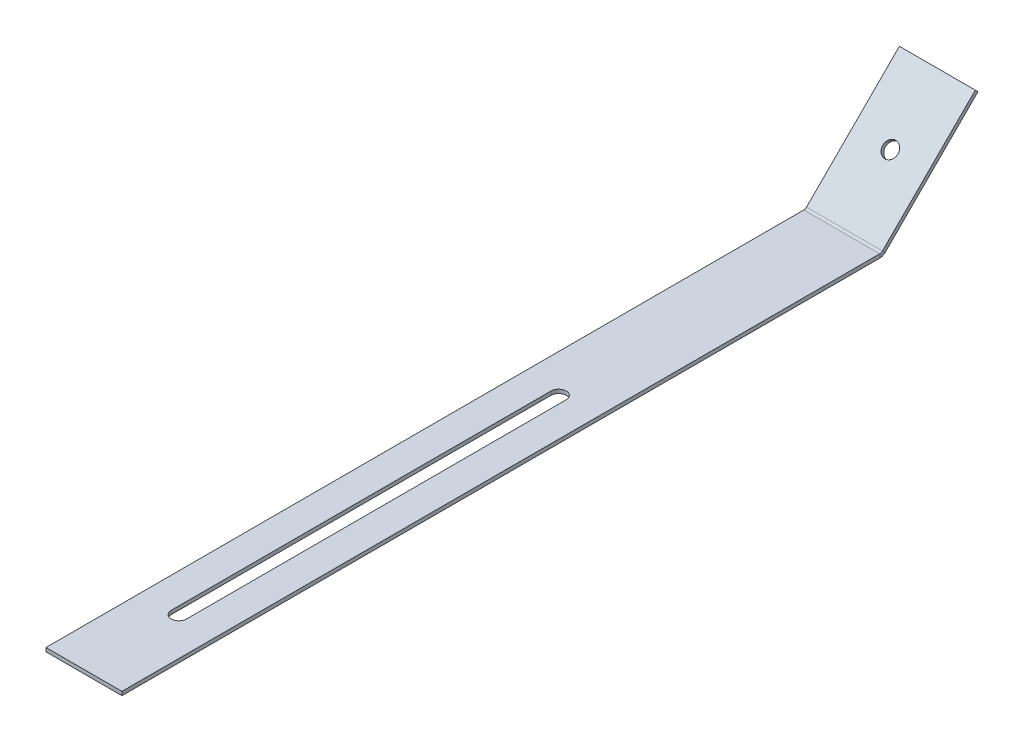
ISO-10303-21;
HEADER;
FILE_DESCRIPTION(('STEP AP214'),'2;1');
FILE_NAME('part.step','',(''),(''),'','','');
FILE_SCHEMA(('AUTOMOTIVE_DESIGN { 1 0 10303 214 1 1 1 1 }'));
ENDSEC;
DATA;
#1=APPLICATION_CONTEXT('core data for automotive mechanical design processes');
#2=APPLICATION_PROTOCOL_DEFINITION('international standard','automotive_design',2000,#1);
#3=PRODUCT_CONTEXT('',#1,'mechanical');
#4=PRODUCT('Part','Part','',(#3));
#5=PRODUCT_RELATED_PRODUCT_CATEGORY('part','',(#4));
#6=PRODUCT_DEFINITION_FORMATION('','',#4);
#7=PRODUCT_DEFINITION_CONTEXT('part definition',#1,'design');
#8=PRODUCT_DEFINITION('design','',#6,#7);
#9=PRODUCT_DEFINITION_SHAPE('','',#8);
#10=(LENGTH_UNIT() NAMED_UNIT(*) SI_UNIT(.MILLI.,.METRE.));
#11=(NAMED_UNIT(*) PLANE_ANGLE_UNIT() SI_UNIT($,.RADIAN.));
#12=(NAMED_UNIT(*) SI_UNIT($,.STERADIAN.) SOLID_ANGLE_UNIT());
#13=UNCERTAINTY_MEASURE_WITH_UNIT(LENGTH_MEASURE(1.E-05),#10,'distance_accuracy_value','');
#14=(GEOMETRIC_REPRESENTATION_CONTEXT(3) GLOBAL_UNCERTAINTY_ASSIGNED_CONTEXT((#13)) GLOBAL_UNIT_ASSIGNED_CONTEXT((#10,
#11,#12)) REPRESENTATION_CONTEXT('',''));
#15=CARTESIAN_POINT('',(0.,0.,0.));
#16=DIRECTION('',(0.,0.,1.));
#17=DIRECTION('',(1.,0.,0.));
#18=AXIS2_PLACEMENT_3D('',#15,#16,#17);
#19=CARTESIAN_POINT('',(40.,0.585786437626914,-400.585786437627));
#20=DIRECTION('',(1.,0.,0.));
#21=DIRECTION('',(0.,0.,-1.));
#22=AXIS2_PLACEMENT_3D('',#19,#20,#21);
#23=PLANE('',#22);
#24=DIRECTION('',(0.,-0.707106781186547,-0.707106781186547));
#25=VECTOR('',#24,1.);
#26=CARTESIAN_POINT('',(40.,0.585786437626914,-400.585786437627));
#27=LINE('',#26,#25);
#28=CARTESIAN_POINT('',(40.,0.585786437626914,-400.585786437627));
#29=VERTEX_POINT('',#28);
#30=CARTESIAN_POINT('',(40.,-0.828427124746176,-402.));
#31=VERTEX_POINT('',#30);
#32=EDGE_CURVE('E11',#29,#31,#27,.T.);
#33=ORIENTED_EDGE('',*,*,#32,.F.);
#34=CARTESIAN_POINT('',(40.,1.99999999999999,-399.171572875254));
#35=DIRECTION('',(-1.,0.,0.));
#36=DIRECTION('',(0.,0.,1.));
#37=AXIS2_PLACEMENT_3D('',#34,#35,#36);
#38=CIRCLE('',#37,2.);
#39=CARTESIAN_POINT('',(40.,0.,-399.171572875254));
#40=VERTEX_POINT('',#39);
#41=EDGE_CURVE('E178',#40,#29,#38,.F.);
#42=ORIENTED_EDGE('',*,*,#41,.F.);
#43=DIRECTION('',(0.,1.,0.));
#44=VECTOR('',#43,1.);
#45=CARTESIAN_POINT('',(40.,-2.00000000000001,-399.171572875254));
#46=LINE('',#45,#44);
#47=CARTESIAN_POINT('',(40.,-2.00000000000001,-399.171572875254));
#48=VERTEX_POINT('',#47);
#49=EDGE_CURVE('E51',#48,#40,#46,.T.);
#50=ORIENTED_EDGE('',*,*,#49,.F.);
#51=CARTESIAN_POINT('',(40.,1.99999999999999,-399.171572875254));
#52=DIRECTION('',(1.,0.,0.));
#53=DIRECTION('',(0.,0.,-1.));
#54=AXIS2_PLACEMENT_3D('',#51,#52,#53);
#55=CIRCLE('',#54,4.);
#56=EDGE_CURVE('E190',#48,#31,#55,.T.);
#57=ORIENTED_EDGE('',*,*,#56,.T.);
#58=EDGE_LOOP('',(#33,#42,#50,#57));
#59=FACE_BOUND('',#58,.T.);
#60=ADVANCED_FACE('F44',(#59),#23,.T.);
#61=CARTESIAN_POINT('',(40.,-2.00000000000001,-399.171572875254));
#62=DIRECTION('',(1.,0.,0.));
#63=DIRECTION('',(0.,0.,-1.));
#64=AXIS2_PLACEMENT_3D('',#61,#62,#63);
#65=PLANE('',#64);
#66=DIRECTION('',(0.,0.70710678118655,-0.707106781186545));
#67=VECTOR('',#66,1.);
#68=CARTESIAN_POINT('',(40.,0.,-400.));
#69=LINE('',#68,#67);
#70=CARTESIAN_POINT('',(40.,49.4974746830584,-449.497474683058));
#71=VERTEX_POINT('',#70);
#72=EDGE_CURVE('E175',#29,#71,#69,.T.);
#73=ORIENTED_EDGE('',*,*,#72,.F.);
#74=ORIENTED_EDGE('',*,*,#32,.T.);
#75=DIRECTION('',(0.,0.70710678118655,-0.707106781186545));
#76=VECTOR('',#75,1.);
#77=CARTESIAN_POINT('',(40.,-1.41421356237309,-401.414213562373));
#78=LINE('',#77,#76);
#79=CARTESIAN_POINT('',(40.,48.0832611206854,-450.911688245431));
#80=VERTEX_POINT('',#79);
#81=EDGE_CURVE('E169',#31,#80,#78,.T.);
#82=ORIENTED_EDGE('',*,*,#81,.T.);
#83=DIRECTION('',(0.,-0.707106781186547,-0.707106781186547));
#84=VECTOR('',#83,1.);
#85=CARTESIAN_POINT('',(40.,49.4974746830584,-449.497474683058));
#86=LINE('',#85,#84);
#87=EDGE_CURVE('E171',#71,#80,#86,.T.);
#88=ORIENTED_EDGE('',*,*,#87,.F.);
#89=EDGE_LOOP('',(#73,#74,#82,#88));
#90=FACE_BOUND('',#89,.T.);
#91=ADVANCED_FACE('F271',(#90),#65,.T.);
#92=CARTESIAN_POINT('',(0.,0.,-399.171572875254));
#93=DIRECTION('',(-1.,0.,0.));
#94=DIRECTION('',(0.,0.,1.));
#95=AXIS2_PLACEMENT_3D('',#92,#93,#94);
#96=PLANE('',#95);
#97=DIRECTION('',(0.,-1.,0.));
#98=VECTOR('',#97,1.);
#99=CARTESIAN_POINT('',(0.,0.,-399.171572875254));
#100=LINE('',#99,#98);
#101=CARTESIAN_POINT('',(0.,0.,-399.171572875254));
#102=VERTEX_POINT('',#101);
#103=CARTESIAN_POINT('',(0.,-2.00000000000001,-399.171572875254));
#104=VERTEX_POINT('',#103);
#105=EDGE_CURVE('E237',#102,#104,#100,.T.);
#106=ORIENTED_EDGE('',*,*,#105,.F.);
#107=CARTESIAN_POINT('',(0.,1.99999999999999,-399.171572875254));
#108=DIRECTION('',(-1.,0.,0.));
#109=DIRECTION('',(0.,0.,1.));
#110=AXIS2_PLACEMENT_3D('',#107,#108,#109);
#111=CIRCLE('',#110,2.);
#112=CARTESIAN_POINT('',(0.,0.585786437626914,-400.585786437627));
#113=VERTEX_POINT('',#112);
#114=EDGE_CURVE('E202',#102,#113,#111,.F.);
#115=ORIENTED_EDGE('',*,*,#114,.T.);
#116=DIRECTION('',(0.,0.707106781186547,0.707106781186547));
#117=VECTOR('',#116,1.);
#118=CARTESIAN_POINT('',(0.,-0.828427124746176,-402.));
#119=LINE('',#118,#117);
#120=CARTESIAN_POINT('',(0.,-0.828427124746176,-402.));
#121=VERTEX_POINT('',#120);
#122=EDGE_CURVE('E235',#121,#113,#119,.T.);
#123=ORIENTED_EDGE('',*,*,#122,.F.);
#124=CARTESIAN_POINT('',(0.,1.99999999999999,-399.171572875254));
#125=DIRECTION('',(1.,0.,0.));
#126=DIRECTION('',(0.,0.,-1.));
#127=AXIS2_PLACEMENT_3D('',#124,#125,#126);
#128=CIRCLE('',#127,4.);
#129=EDGE_CURVE('E172',#104,#121,#128,.T.);
#130=ORIENTED_EDGE('',*,*,#129,.F.);
#131=EDGE_LOOP('',(#106,#115,#123,#130));
#132=FACE_BOUND('',#131,.T.);
#133=ADVANCED_FACE('F278',(#132),#96,.T.);
#134=CARTESIAN_POINT('',(0.,-0.828427124746176,-402.));
#135=DIRECTION('',(-1.,0.,0.));
#136=DIRECTION('',(0.,0.,1.));
#137=AXIS2_PLACEMENT_3D('',#134,#135,#136);
#138=PLANE('',#137);
#139=DIRECTION('',(0.,0.,-1.));
#140=VECTOR('',#139,1.);
#141=CARTESIAN_POINT('',(0.,0.,0.));
#142=LINE('',#141,#140);
#143=CARTESIAN_POINT('',(0.,0.,0.));
#144=VERTEX_POINT('',#143);
#145=EDGE_CURVE('E205',#144,#102,#142,.T.);
#146=ORIENTED_EDGE('',*,*,#145,.T.);
#147=ORIENTED_EDGE('',*,*,#105,.T.);
#148=DIRECTION('',(0.,0.,-1.));
#149=VECTOR('',#148,1.);
#150=CARTESIAN_POINT('',(0.,-2.,0.));
#151=LINE('',#150,#149);
#152=CARTESIAN_POINT('',(0.,-2.,0.));
#153=VERTEX_POINT('',#152);
#154=EDGE_CURVE('E211',#153,#104,#151,.T.);
#155=ORIENTED_EDGE('',*,*,#154,.F.);
#156=DIRECTION('',(0.,1.,0.));
#157=VECTOR('',#156,1.);
#158=CARTESIAN_POINT('',(0.,-2.,0.));
#159=LINE('',#158,#157);
#160=EDGE_CURVE('E208',#153,#144,#159,.T.);
#161=ORIENTED_EDGE('',*,*,#160,.T.);
#162=EDGE_LOOP('',(#146,#147,#155,#161));
#163=FACE_BOUND('',#162,.T.);
#164=ADVANCED_FACE('F280',(#163),#138,.T.);
#165=CARTESIAN_POINT('',(40.,-1.41421356237309,-401.414213562373));
#166=DIRECTION('',(0.,0.707106781186545,0.70710678118655));
#167=DIRECTION('',(0.,-0.70710678118655,0.707106781186545));
#168=AXIS2_PLACEMENT_3D('',#165,#166,#167);
#169=PLANE('',#168);
#170=CARTESIAN_POINT('',(20.,23.3345237791562,-426.162950903902));
#171=DIRECTION('',(0.,0.707106781186545,0.70710678118655));
#172=DIRECTION('',(0.,-0.70710678118655,0.707106781186545));
#173=AXIS2_PLACEMENT_3D('',#170,#171,#172);
#174=CIRCLE('',#173,3.99999999999999);
#175=CARTESIAN_POINT('',(20.,20.50609665441,-423.334523779156));
#176=VERTEX_POINT('',#175);
#177=EDGE_CURVE('E165',#176,#176,#174,.F.);
#178=ORIENTED_EDGE('',*,*,#177,.F.);
#179=EDGE_LOOP('',(#178));
#180=FACE_BOUND('',#179,.T.);
#181=DIRECTION('',(0.,0.70710678118655,-0.707106781186545));
#182=VECTOR('',#181,1.);
#183=CARTESIAN_POINT('',(0.,-1.41421356237309,-401.414213562373));
#184=LINE('',#183,#182);
#185=CARTESIAN_POINT('',(0.,48.0832611206854,-450.911688245431));
#186=VERTEX_POINT('',#185);
#187=EDGE_CURVE('E168',#121,#186,#184,.T.);
#188=ORIENTED_EDGE('',*,*,#187,.T.);
#189=DIRECTION('',(-1.,0.,0.));
#190=VECTOR('',#189,1.);
#191=CARTESIAN_POINT('',(40.,48.0832611206854,-450.911688245431));
#192=LINE('',#191,#190);
#193=EDGE_CURVE('E233',#80,#186,#192,.T.);
#194=ORIENTED_EDGE('',*,*,#193,.F.);
#195=ORIENTED_EDGE('',*,*,#81,.F.);
#196=DIRECTION('',(-1.,0.,0.));
#197=VECTOR('',#196,1.);
#198=CARTESIAN_POINT('',(40.,-0.828427124746176,-402.));
#199=LINE('',#198,#197);
#200=EDGE_CURVE('E193',#31,#121,#199,.T.);
#201=ORIENTED_EDGE('',*,*,#200,.T.);
#202=EDGE_LOOP('',(#188,#194,#195,#201));
#203=FACE_BOUND('',#202,.T.);
#204=ADVANCED_FACE('F267',(#180,#203),#169,.F.);
#205=CARTESIAN_POINT('',(40.,49.4974746830584,-449.497474683058));
#206=DIRECTION('',(0.,0.707106781186548,-0.707106781186548));
#207=DIRECTION('',(0.,0.707106781186548,0.707106781186548));
#208=AXIS2_PLACEMENT_3D('',#205,#206,#207);
#209=PLANE('',#208);
#210=DIRECTION('',(0.,-0.707106781186547,-0.707106781186547));
#211=VECTOR('',#210,1.);
#212=CARTESIAN_POINT('',(0.,49.4974746830584,-449.497474683058));
#213=LINE('',#212,#211);
#214=CARTESIAN_POINT('',(0.,49.4974746830584,-449.497474683058));
#215=VERTEX_POINT('',#214);
#216=EDGE_CURVE('E196',#215,#186,#213,.T.);
#217=ORIENTED_EDGE('',*,*,#216,.F.);
#218=DIRECTION('',(-1.,0.,0.));
#219=VECTOR('',#218,1.);
#220=CARTESIAN_POINT('',(40.,49.4974746830584,-449.497474683058));
#221=LINE('',#220,#219);
#222=EDGE_CURVE('E231',#71,#215,#221,.T.);
#223=ORIENTED_EDGE('',*,*,#222,.F.);
#224=ORIENTED_EDGE('',*,*,#87,.T.);
#225=ORIENTED_EDGE('',*,*,#193,.T.);
#226=EDGE_LOOP('',(#217,#223,#224,#225));
#227=FACE_BOUND('',#226,.T.);
#228=ADVANCED_FACE('F288',(#227),#209,.T.);
#229=CARTESIAN_POINT('',(40.,0.,-400.));
#230=DIRECTION('',(0.,0.707106781186545,0.70710678118655));
#231=DIRECTION('',(0.,-0.70710678118655,0.707106781186545));
#232=AXIS2_PLACEMENT_3D('',#229,#230,#231);
#233=PLANE('',#232);
#234=CARTESIAN_POINT('',(20.,24.7487373415292,-424.748737341529));
#235=DIRECTION('',(0.,0.707106781186546,0.70710678118655));
#236=DIRECTION('',(0.,-0.70710678118655,0.707106781186546));
#237=AXIS2_PLACEMENT_3D('',#234,#235,#236);
#238=CIRCLE('',#237,3.99999999999999);
#239=CARTESIAN_POINT('',(20.,21.920310216783,-421.920310216783));
#240=VERTEX_POINT('',#239);
#241=EDGE_CURVE('E161',#240,#240,#238,.T.);
#242=ORIENTED_EDGE('',*,*,#241,.F.);
#243=EDGE_LOOP('',(#242));
#244=FACE_BOUND('',#243,.T.);
#245=DIRECTION('',(0.,0.70710678118655,-0.707106781186545));
#246=VECTOR('',#245,1.);
#247=CARTESIAN_POINT('',(0.,0.,-400.));
#248=LINE('',#247,#246);
#249=EDGE_CURVE('E199',#113,#215,#248,.T.);
#250=ORIENTED_EDGE('',*,*,#249,.F.);
#251=DIRECTION('',(-1.,0.,0.));
#252=VECTOR('',#251,1.);
#253=CARTESIAN_POINT('',(40.,0.585786437626914,-400.585786437627));
#254=LINE('',#253,#252);
#255=EDGE_CURVE('E228',#29,#113,#254,.T.);
#256=ORIENTED_EDGE('',*,*,#255,.F.);
#257=ORIENTED_EDGE('',*,*,#72,.T.);
#258=ORIENTED_EDGE('',*,*,#222,.T.);
#259=EDGE_LOOP('',(#250,#256,#257,#258));
#260=FACE_BOUND('',#259,.T.);
#261=ADVANCED_FACE('F274',(#244,#260),#233,.T.);
#262=CARTESIAN_POINT('',(40.,1.99999999999999,-399.171572875254));
#263=DIRECTION('',(-1.,0.,0.));
#264=DIRECTION('',(0.,0.,1.));
#265=AXIS2_PLACEMENT_3D('',#262,#263,#264);
#266=CYLINDRICAL_SURFACE('',#265,2.);
#267=ORIENTED_EDGE('',*,*,#114,.F.);
#268=DIRECTION('',(-1.,0.,0.));
#269=VECTOR('',#268,1.);
#270=CARTESIAN_POINT('',(40.,0.,-399.171572875254));
#271=LINE('',#270,#269);
#272=EDGE_CURVE('E225',#40,#102,#271,.T.);
#273=ORIENTED_EDGE('',*,*,#272,.F.);
#274=ORIENTED_EDGE('',*,*,#41,.T.);
#275=ORIENTED_EDGE('',*,*,#255,.T.);
#276=EDGE_LOOP('',(#267,#273,#274,#275));
#277=FACE_BOUND('',#276,.T.);
#278=ADVANCED_FACE('F249',(#277),#266,.F.);
#279=CARTESIAN_POINT('',(40.,0.,0.));
#280=DIRECTION('',(0.,1.,0.));
#281=DIRECTION('',(0.,0.,1.));
#282=AXIS2_PLACEMENT_3D('',#279,#280,#281);
#283=PLANE('',#282);
#284=CARTESIAN_POINT('',(20.,0.,-250.));
#285=DIRECTION('',(0.,1.,0.));
#286=DIRECTION('',(0.,0.,1.));
#287=AXIS2_PLACEMENT_3D('',#284,#285,#286);
#288=CIRCLE('',#287,4.);
#289=CARTESIAN_POINT('',(24.,0.,-250.));
#290=VERTEX_POINT('',#289);
#291=CARTESIAN_POINT('',(16.,0.,-250.));
#292=VERTEX_POINT('',#291);
#293=EDGE_CURVE('E58',#290,#292,#288,.T.);
#294=ORIENTED_EDGE('',*,*,#293,.F.);
#295=DIRECTION('',(0.,0.,-1.));
#296=VECTOR('',#295,1.);
#297=CARTESIAN_POINT('',(24.,0.,-49.9999999999999));
#298=LINE('',#297,#296);
#299=CARTESIAN_POINT('',(24.,0.,-49.9999999999999));
#300=VERTEX_POINT('',#299);
#301=EDGE_CURVE('E150',#300,#290,#298,.T.);
#302=ORIENTED_EDGE('',*,*,#301,.F.);
#303=CARTESIAN_POINT('',(20.,0.,-49.9999999999999));
#304=DIRECTION('',(0.,1.,0.));
#305=DIRECTION('',(0.,0.,1.));
#306=AXIS2_PLACEMENT_3D('',#303,#304,#305);
#307=CIRCLE('',#306,4.);
#308=CARTESIAN_POINT('',(16.,0.,-49.9999999999999));
#309=VERTEX_POINT('',#308);
#310=EDGE_CURVE('E134',#309,#300,#307,.T.);
#311=ORIENTED_EDGE('',*,*,#310,.F.);
#312=DIRECTION('',(0.,0.,1.));
#313=VECTOR('',#312,1.);
#314=CARTESIAN_POINT('',(16.,0.,-49.9999999999999));
#315=LINE('',#314,#313);
#316=EDGE_CURVE('E143',#292,#309,#315,.T.);
#317=ORIENTED_EDGE('',*,*,#316,.F.);
#318=EDGE_LOOP('',(#294,#302,#311,#317));
#319=FACE_BOUND('',#318,.T.);
#320=ORIENTED_EDGE('',*,*,#145,.F.);
#321=DIRECTION('',(-1.,0.,0.));
#322=VECTOR('',#321,1.);
#323=CARTESIAN_POINT('',(40.,0.,0.));
#324=LINE('',#323,#322);
#325=CARTESIAN_POINT('',(40.,0.,0.));
#326=VERTEX_POINT('',#325);
#327=EDGE_CURVE('E223',#326,#144,#324,.T.);
#328=ORIENTED_EDGE('',*,*,#327,.F.);
#329=DIRECTION('',(0.,0.,-1.));
#330=VECTOR('',#329,1.);
#331=CARTESIAN_POINT('',(40.,0.,0.));
#332=LINE('',#331,#330);
#333=EDGE_CURVE('E181',#326,#40,#332,.T.);
#334=ORIENTED_EDGE('',*,*,#333,.T.);
#335=ORIENTED_EDGE('',*,*,#272,.T.);
#336=EDGE_LOOP('',(#320,#328,#334,#335));
#337=FACE_BOUND('',#336,.T.);
#338=ADVANCED_FACE('F147',(#319,#337),#283,.T.);
#339=CARTESIAN_POINT('',(40.,-2.,0.));
#340=DIRECTION('',(0.,0.,1.));
#341=DIRECTION('',(1.,0.,0.));
#342=AXIS2_PLACEMENT_3D('',#339,#340,#341);
#343=PLANE('',#342);
#344=ORIENTED_EDGE('',*,*,#160,.F.);
#345=DIRECTION('',(-1.,0.,0.));
#346=VECTOR('',#345,1.);
#347=CARTESIAN_POINT('',(40.,-2.,0.));
#348=LINE('',#347,#346);
#349=CARTESIAN_POINT('',(40.,-2.,0.));
#350=VERTEX_POINT('',#349);
#351=EDGE_CURVE('E221',#350,#153,#348,.T.);
#352=ORIENTED_EDGE('',*,*,#351,.F.);
#353=DIRECTION('',(0.,1.,0.));
#354=VECTOR('',#353,1.);
#355=CARTESIAN_POINT('',(40.,-2.,0.));
#356=LINE('',#355,#354);
#357=EDGE_CURVE('E184',#350,#326,#356,.T.);
#358=ORIENTED_EDGE('',*,*,#357,.T.);
#359=ORIENTED_EDGE('',*,*,#327,.T.);
#360=EDGE_LOOP('',(#344,#352,#358,#359));
#361=FACE_BOUND('',#360,.T.);
#362=ADVANCED_FACE('F254',(#361),#343,.T.);
#363=CARTESIAN_POINT('',(40.,-2.,0.));
#364=DIRECTION('',(0.,1.,0.));
#365=DIRECTION('',(0.,0.,1.));
#366=AXIS2_PLACEMENT_3D('',#363,#364,#365);
#367=PLANE('',#366);
#368=DIRECTION('',(0.,0.,1.));
#369=VECTOR('',#368,1.);
#370=CARTESIAN_POINT('',(24.,-2.,-49.9999999999999));
#371=LINE('',#370,#369);
#372=CARTESIAN_POINT('',(24.,-2.,-250.));
#373=VERTEX_POINT('',#372);
#374=CARTESIAN_POINT('',(24.,-2.,-49.9999999999999));
#375=VERTEX_POINT('',#374);
#376=EDGE_CURVE('E482',#373,#375,#371,.T.);
#377=ORIENTED_EDGE('',*,*,#376,.F.);
#378=CARTESIAN_POINT('',(20.,-2.,-250.));
#379=DIRECTION('',(0.,1.,0.));
#380=DIRECTION('',(0.,0.,1.));
#381=AXIS2_PLACEMENT_3D('',#378,#379,#380);
#382=CIRCLE('',#381,4.);
#383=CARTESIAN_POINT('',(16.,-2.,-250.));
#384=VERTEX_POINT('',#383);
#385=EDGE_CURVE('E162',#384,#373,#382,.F.);
#386=ORIENTED_EDGE('',*,*,#385,.F.);
#387=DIRECTION('',(0.,0.,-1.));
#388=VECTOR('',#387,1.);
#389=CARTESIAN_POINT('',(16.,-2.,-49.9999999999999));
#390=LINE('',#389,#388);
#391=CARTESIAN_POINT('',(16.,-2.,-49.9999999999999));
#392=VERTEX_POINT('',#391);
#393=EDGE_CURVE('E159',#392,#384,#390,.T.);
#394=ORIENTED_EDGE('',*,*,#393,.F.);
#395=CARTESIAN_POINT('',(20.,-2.,-49.9999999999999));
#396=DIRECTION('',(0.,1.,0.));
#397=DIRECTION('',(0.,0.,1.));
#398=AXIS2_PLACEMENT_3D('',#395,#396,#397);
#399=CIRCLE('',#398,4.);
#400=EDGE_CURVE('E137',#375,#392,#399,.F.);
#401=ORIENTED_EDGE('',*,*,#400,.F.);
#402=EDGE_LOOP('',(#377,#386,#394,#401));
#403=FACE_BOUND('',#402,.T.);
#404=ORIENTED_EDGE('',*,*,#154,.T.);
#405=DIRECTION('',(-1.,0.,0.));
#406=VECTOR('',#405,1.);
#407=CARTESIAN_POINT('',(40.,-2.00000000000001,-399.171572875254));
#408=LINE('',#407,#406);
#409=EDGE_CURVE('E218',#48,#104,#408,.T.);
#410=ORIENTED_EDGE('',*,*,#409,.F.);
#411=DIRECTION('',(0.,0.,-1.));
#412=VECTOR('',#411,1.);
#413=CARTESIAN_POINT('',(40.,-2.,0.));
#414=LINE('',#413,#412);
#415=EDGE_CURVE('E187',#350,#48,#414,.T.);
#416=ORIENTED_EDGE('',*,*,#415,.F.);
#417=ORIENTED_EDGE('',*,*,#351,.T.);
#418=EDGE_LOOP('',(#404,#410,#416,#417));
#419=FACE_BOUND('',#418,.T.);
#420=ADVANCED_FACE('F257',(#403,#419),#367,.F.);
#421=CARTESIAN_POINT('',(40.,1.99999999999999,-399.171572875254));
#422=DIRECTION('',(-1.,0.,0.));
#423=DIRECTION('',(0.,0.,1.));
#424=AXIS2_PLACEMENT_3D('',#421,#422,#423);
#425=CYLINDRICAL_SURFACE('',#424,4.);
#426=ORIENTED_EDGE('',*,*,#129,.T.);
#427=ORIENTED_EDGE('',*,*,#200,.F.);
#428=ORIENTED_EDGE('',*,*,#56,.F.);
#429=ORIENTED_EDGE('',*,*,#409,.T.);
#430=EDGE_LOOP('',(#426,#427,#428,#429));
#431=FACE_BOUND('',#430,.T.);
#432=ADVANCED_FACE('F262',(#431),#425,.T.);
#433=CARTESIAN_POINT('',(40.,1.99999999999999,-399.171572875254));
#434=DIRECTION('',(-1.,0.,0.));
#435=DIRECTION('',(0.,0.,1.));
#436=AXIS2_PLACEMENT_3D('',#433,#434,#435);
#437=PLANE('',#436);
#438=ORIENTED_EDGE('',*,*,#415,.T.);
#439=ORIENTED_EDGE('',*,*,#49,.T.);
#440=ORIENTED_EDGE('',*,*,#333,.F.);
#441=ORIENTED_EDGE('',*,*,#357,.F.);
#442=EDGE_LOOP('',(#438,#439,#440,#441));
#443=FACE_BOUND('',#442,.T.);
#444=ADVANCED_FACE('F241',(#443),#437,.F.);
#445=CARTESIAN_POINT('',(0.,1.99999999999999,-399.171572875254));
#446=DIRECTION('',(-1.,0.,0.));
#447=DIRECTION('',(0.,0.,1.));
#448=AXIS2_PLACEMENT_3D('',#445,#446,#447);
#449=PLANE('',#448);
#450=ORIENTED_EDGE('',*,*,#187,.F.);
#451=ORIENTED_EDGE('',*,*,#122,.T.);
#452=ORIENTED_EDGE('',*,*,#249,.T.);
#453=ORIENTED_EDGE('',*,*,#216,.T.);
#454=EDGE_LOOP('',(#450,#451,#452,#453));
#455=FACE_BOUND('',#454,.T.);
#456=ADVANCED_FACE('F394',(#455),#449,.T.);
#457=CARTESIAN_POINT('',(20.,15.3345237791562,-434.162950903902));
#458=DIRECTION('',(0.,0.707106781186546,0.707106781186549));
#459=DIRECTION('',(0.,-0.707106781186549,0.707106781186546));
#460=AXIS2_PLACEMENT_3D('',#457,#458,#459);
#461=CYLINDRICAL_SURFACE('',#460,3.99999999999999);
#462=ORIENTED_EDGE('',*,*,#177,.T.);
#463=EDGE_LOOP('',(#462));
#464=FACE_BOUND('',#463,.T.);
#465=ORIENTED_EDGE('',*,*,#241,.T.);
#466=EDGE_LOOP('',(#465));
#467=FACE_BOUND('',#466,.T.);
#468=ADVANCED_FACE('F403',(#464,#467),#461,.F.);
#469=CARTESIAN_POINT('',(20.,-210.153789300123,-250.));
#470=DIRECTION('',(0.,1.,0.));
#471=DIRECTION('',(0.,0.,1.));
#472=AXIS2_PLACEMENT_3D('',#469,#470,#471);
#473=CYLINDRICAL_SURFACE('',#472,4.);
#474=ORIENTED_EDGE('',*,*,#385,.T.);
#475=DIRECTION('',(0.,1.,0.));
#476=VECTOR('',#475,1.);
#477=CARTESIAN_POINT('',(24.,-210.153789300123,-250.));
#478=LINE('',#477,#476);
#479=EDGE_CURVE('E155',#373,#290,#478,.T.);
#480=ORIENTED_EDGE('',*,*,#479,.T.);
#481=ORIENTED_EDGE('',*,*,#293,.T.);
#482=DIRECTION('',(0.,1.,0.));
#483=VECTOR('',#482,1.);
#484=CARTESIAN_POINT('',(16.,-210.153789300123,-250.));
#485=LINE('',#484,#483);
#486=EDGE_CURVE('E140',#384,#292,#485,.T.);
#487=ORIENTED_EDGE('',*,*,#486,.F.);
#488=EDGE_LOOP('',(#474,#480,#481,#487));
#489=FACE_BOUND('',#488,.T.);
#490=ADVANCED_FACE('F412',(#489),#473,.F.);
#491=CARTESIAN_POINT('',(24.,-210.153789300123,-49.9999999999999));
#492=DIRECTION('',(1.,0.,0.));
#493=DIRECTION('',(0.,0.,-1.));
#494=AXIS2_PLACEMENT_3D('',#491,#492,#493);
#495=PLANE('',#494);
#496=ORIENTED_EDGE('',*,*,#376,.T.);
#497=DIRECTION('',(0.,1.,0.));
#498=VECTOR('',#497,1.);
#499=CARTESIAN_POINT('',(24.,-210.153789300123,-49.9999999999999));
#500=LINE('',#499,#498);
#501=EDGE_CURVE('E139',#375,#300,#500,.T.);
#502=ORIENTED_EDGE('',*,*,#501,.T.);
#503=ORIENTED_EDGE('',*,*,#301,.T.);
#504=ORIENTED_EDGE('',*,*,#479,.F.);
#505=EDGE_LOOP('',(#496,#502,#503,#504));
#506=FACE_BOUND('',#505,.T.);
#507=ADVANCED_FACE('F422',(#506),#495,.F.);
#508=CARTESIAN_POINT('',(20.,-210.153789300123,-49.9999999999999));
#509=DIRECTION('',(0.,1.,0.));
#510=DIRECTION('',(0.,0.,1.));
#511=AXIS2_PLACEMENT_3D('',#508,#509,#510);
#512=CYLINDRICAL_SURFACE('',#511,4.);
#513=ORIENTED_EDGE('',*,*,#400,.T.);
#514=DIRECTION('',(0.,1.,0.));
#515=VECTOR('',#514,1.);
#516=CARTESIAN_POINT('',(16.,-210.153789300123,-49.9999999999999));
#517=LINE('',#516,#515);
#518=EDGE_CURVE('E66',#392,#309,#517,.T.);
#519=ORIENTED_EDGE('',*,*,#518,.T.);
#520=ORIENTED_EDGE('',*,*,#310,.T.);
#521=ORIENTED_EDGE('',*,*,#501,.F.);
#522=EDGE_LOOP('',(#513,#519,#520,#521));
#523=FACE_BOUND('',#522,.T.);
#524=ADVANCED_FACE('F131',(#523),#512,.F.);
#525=CARTESIAN_POINT('',(16.,-210.153789300123,-49.9999999999999));
#526=DIRECTION('',(-1.,0.,0.));
#527=DIRECTION('',(0.,0.,1.));
#528=AXIS2_PLACEMENT_3D('',#525,#526,#527);
#529=PLANE('',#528);
#530=ORIENTED_EDGE('',*,*,#393,.T.);
#531=ORIENTED_EDGE('',*,*,#486,.T.);
#532=ORIENTED_EDGE('',*,*,#316,.T.);
#533=ORIENTED_EDGE('',*,*,#518,.F.);
#534=EDGE_LOOP('',(#530,#531,#532,#533));
#535=FACE_BOUND('',#534,.T.);
#536=ADVANCED_FACE('F144',(#535),#529,.F.);
#537=CLOSED_SHELL('',(#60,#91,#133,#164,#204,#228,#261,#278,#338,#362,#420,#432,#444,#456,#468,
#490,#507,#524,#536));
#538=MANIFOLD_SOLID_BREP('B2',#537);
#539=ADVANCED_BREP_SHAPE_REPRESENTATION('',(#18,#538),#14);
#540=SHAPE_DEFINITION_REPRESENTATION(#9,#539);
ENDSEC;
END-ISO-10303-21;
